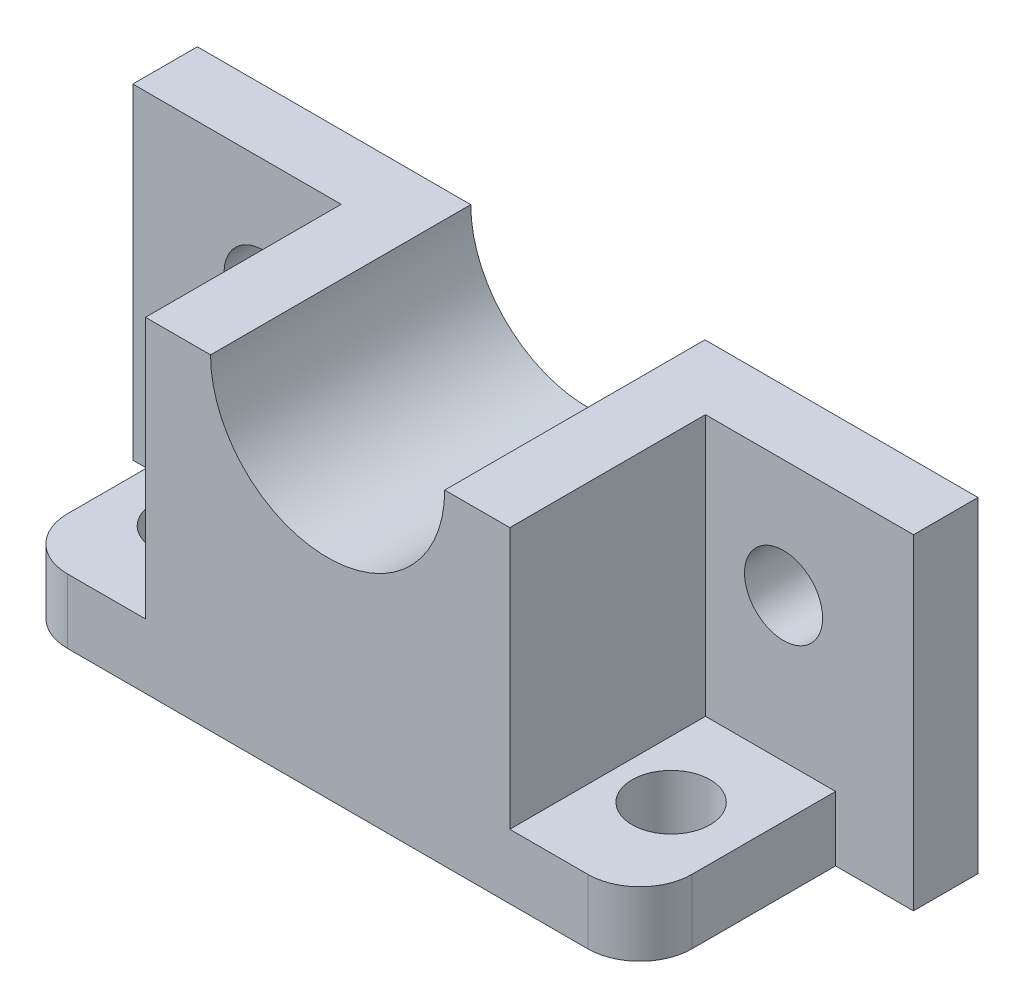
ISO-10303-21;
HEADER;
FILE_DESCRIPTION(('STEP AP214'),'2;1');
FILE_NAME('part.step','',(''),(''),'','','');
FILE_SCHEMA(('AUTOMOTIVE_DESIGN { 1 0 10303 214 1 1 1 1 }'));
ENDSEC;
DATA;
#1=APPLICATION_CONTEXT('core data for automotive mechanical design processes');
#2=APPLICATION_PROTOCOL_DEFINITION('international standard','automotive_design',2000,#1);
#3=PRODUCT_CONTEXT('',#1,'mechanical');
#4=PRODUCT('Part','Part','',(#3));
#5=PRODUCT_RELATED_PRODUCT_CATEGORY('part','',(#4));
#6=PRODUCT_DEFINITION_FORMATION('','',#4);
#7=PRODUCT_DEFINITION_CONTEXT('part definition',#1,'design');
#8=PRODUCT_DEFINITION('design','',#6,#7);
#9=PRODUCT_DEFINITION_SHAPE('','',#8);
#10=(LENGTH_UNIT() NAMED_UNIT(*) SI_UNIT(.MILLI.,.METRE.));
#11=(NAMED_UNIT(*) PLANE_ANGLE_UNIT() SI_UNIT($,.RADIAN.));
#12=(NAMED_UNIT(*) SI_UNIT($,.STERADIAN.) SOLID_ANGLE_UNIT());
#13=UNCERTAINTY_MEASURE_WITH_UNIT(LENGTH_MEASURE(1.E-05),#10,'distance_accuracy_value','');
#14=(GEOMETRIC_REPRESENTATION_CONTEXT(3) GLOBAL_UNCERTAINTY_ASSIGNED_CONTEXT((#13)) GLOBAL_UNIT_ASSIGNED_CONTEXT((#10,
#11,#12)) REPRESENTATION_CONTEXT('',''));
#15=CARTESIAN_POINT('',(0.,0.,0.));
#16=DIRECTION('',(0.,0.,1.));
#17=DIRECTION('',(1.,0.,0.));
#18=AXIS2_PLACEMENT_3D('',#15,#16,#17);
#19=CARTESIAN_POINT('',(-44.45,0.,63.5));
#20=DIRECTION('',(1.,0.,0.));
#21=DIRECTION('',(0.,1.,0.));
#22=AXIS2_PLACEMENT_3D('',#19,#20,#21);
#23=PLANE('',#22);
#24=DIRECTION('',(0.,0.,1.));
#25=VECTOR('',#24,1.);
#26=CARTESIAN_POINT('',(-44.45,-63.754,15.748));
#27=LINE('',#26,#25);
#28=CARTESIAN_POINT('',(-44.45,-63.754,15.748));
#29=VERTEX_POINT('',#28);
#30=CARTESIAN_POINT('',(-44.45,-63.754,63.5));
#31=VERTEX_POINT('',#30);
#32=EDGE_CURVE('E354',#29,#31,#27,.T.);
#33=ORIENTED_EDGE('',*,*,#32,.T.);
#34=DIRECTION('',(0.,-1.,0.));
#35=VECTOR('',#34,1.);
#36=CARTESIAN_POINT('',(-44.45,0.,63.5));
#37=LINE('',#36,#35);
#38=CARTESIAN_POINT('',(-44.45,0.,63.5));
#39=VERTEX_POINT('',#38);
#40=EDGE_CURVE('E279',#39,#31,#37,.T.);
#41=ORIENTED_EDGE('',*,*,#40,.F.);
#42=DIRECTION('',(0.,0.,-1.));
#43=VECTOR('',#42,1.);
#44=CARTESIAN_POINT('',(-44.45,0.,63.5));
#45=LINE('',#44,#43);
#46=CARTESIAN_POINT('',(-44.45,0.,15.748));
#47=VERTEX_POINT('',#46);
#48=EDGE_CURVE('E210',#39,#47,#45,.T.);
#49=ORIENTED_EDGE('',*,*,#48,.T.);
#50=DIRECTION('',(0.,-1.,0.));
#51=VECTOR('',#50,1.);
#52=CARTESIAN_POINT('',(-44.45,0.,15.748));
#53=LINE('',#52,#51);
#54=EDGE_CURVE('E298',#47,#29,#53,.T.);
#55=ORIENTED_EDGE('',*,*,#54,.T.);
#56=EDGE_LOOP('',(#33,#41,#49,#55));
#57=FACE_BOUND('',#56,.T.);
#58=ADVANCED_FACE('F43',(#57),#23,.F.);
#59=CARTESIAN_POINT('',(0.,0.,15.748));
#60=DIRECTION('',(0.,0.,1.));
#61=DIRECTION('',(1.,0.,0.));
#62=AXIS2_PLACEMENT_3D('',#59,#60,#61);
#63=PLANE('',#62);
#64=CARTESIAN_POINT('',(63.5,-28.702,15.748));
#65=DIRECTION('',(0.,0.,1.));
#66=DIRECTION('',(1.,0.,0.));
#67=AXIS2_PLACEMENT_3D('',#64,#65,#66);
#68=CIRCLE('',#67,9.52500000000001);
#69=CARTESIAN_POINT('',(73.025,-28.702,15.748));
#70=VERTEX_POINT('',#69);
#71=EDGE_CURVE('E180',#70,#70,#68,.T.);
#72=ORIENTED_EDGE('',*,*,#71,.F.);
#73=EDGE_LOOP('',(#72));
#74=FACE_BOUND('',#73,.T.);
#75=DIRECTION('',(0.,-1.,0.));
#76=VECTOR('',#75,1.);
#77=CARTESIAN_POINT('',(76.2,-63.754,15.748));
#78=LINE('',#77,#76);
#79=CARTESIAN_POINT('',(76.2,-63.754,15.748));
#80=VERTEX_POINT('',#79);
#81=CARTESIAN_POINT('',(76.2,-79.502,15.748));
#82=VERTEX_POINT('',#81);
#83=EDGE_CURVE('E161',#80,#82,#78,.T.);
#84=ORIENTED_EDGE('',*,*,#83,.T.);
#85=DIRECTION('',(1.,0.,0.));
#86=VECTOR('',#85,1.);
#87=CARTESIAN_POINT('',(-95.2928278149859,-79.502,15.748));
#88=LINE('',#87,#86);
#89=CARTESIAN_POINT('',(95.2071721850141,-79.502,15.748));
#90=VERTEX_POINT('',#89);
#91=EDGE_CURVE('E174',#82,#90,#88,.T.);
#92=ORIENTED_EDGE('',*,*,#91,.T.);
#93=DIRECTION('',(0.,1.,0.));
#94=VECTOR('',#93,1.);
#95=CARTESIAN_POINT('',(95.2071721850141,-79.502,15.748));
#96=LINE('',#95,#94);
#97=CARTESIAN_POINT('',(95.2071721850141,0.,15.748));
#98=VERTEX_POINT('',#97);
#99=EDGE_CURVE('E193',#90,#98,#96,.T.);
#100=ORIENTED_EDGE('',*,*,#99,.T.);
#101=DIRECTION('',(-1.,0.,0.));
#102=VECTOR('',#101,1.);
#103=CARTESIAN_POINT('',(95.2071721850141,0.,15.748));
#104=LINE('',#103,#102);
#105=CARTESIAN_POINT('',(44.45,0.,15.748));
#106=VERTEX_POINT('',#105);
#107=EDGE_CURVE('E200',#98,#106,#104,.T.);
#108=ORIENTED_EDGE('',*,*,#107,.T.);
#109=DIRECTION('',(0.,1.,0.));
#110=VECTOR('',#109,1.);
#111=CARTESIAN_POINT('',(44.45,0.,15.748));
#112=LINE('',#111,#110);
#113=CARTESIAN_POINT('',(44.45,-63.754,15.748));
#114=VERTEX_POINT('',#113);
#115=EDGE_CURVE('E302',#114,#106,#112,.T.);
#116=ORIENTED_EDGE('',*,*,#115,.F.);
#117=DIRECTION('',(1.,0.,0.));
#118=VECTOR('',#117,1.);
#119=CARTESIAN_POINT('',(44.45,-63.754,15.748));
#120=LINE('',#119,#118);
#121=EDGE_CURVE('E177',#114,#80,#120,.T.);
#122=ORIENTED_EDGE('',*,*,#121,.T.);
#123=EDGE_LOOP('',(#84,#92,#100,#108,#116,#122));
#124=FACE_BOUND('',#123,.T.);
#125=ADVANCED_FACE('F173',(#74,#124),#63,.T.);
#126=CARTESIAN_POINT('',(-28.575,0.,15.748));
#127=DIRECTION('',(0.,-1.,0.));
#128=DIRECTION('',(1.,0.,0.));
#129=AXIS2_PLACEMENT_3D('',#126,#127,#128);
#130=PLANE('',#129);
#131=DIRECTION('',(-1.,0.,0.));
#132=VECTOR('',#131,1.);
#133=CARTESIAN_POINT('',(-28.575,0.,0.));
#134=LINE('',#133,#132);
#135=CARTESIAN_POINT('',(-28.575,0.,0.));
#136=VERTEX_POINT('',#135);
#137=CARTESIAN_POINT('',(-95.2928278149859,0.,0.));
#138=VERTEX_POINT('',#137);
#139=EDGE_CURVE('E205',#136,#138,#134,.T.);
#140=ORIENTED_EDGE('',*,*,#139,.T.);
#141=DIRECTION('',(0.,0.,-1.));
#142=VECTOR('',#141,1.);
#143=CARTESIAN_POINT('',(-95.2928278149859,0.,15.748));
#144=LINE('',#143,#142);
#145=CARTESIAN_POINT('',(-95.2928278149859,0.,15.748));
#146=VERTEX_POINT('',#145);
#147=EDGE_CURVE('E242',#146,#138,#144,.T.);
#148=ORIENTED_EDGE('',*,*,#147,.F.);
#149=DIRECTION('',(-1.,0.,0.));
#150=VECTOR('',#149,1.);
#151=CARTESIAN_POINT('',(-28.575,0.,15.748));
#152=LINE('',#151,#150);
#153=EDGE_CURVE('E194',#47,#146,#152,.T.);
#154=ORIENTED_EDGE('',*,*,#153,.F.);
#155=ORIENTED_EDGE('',*,*,#48,.F.);
#156=DIRECTION('',(-1.,0.,0.));
#157=VECTOR('',#156,1.);
#158=CARTESIAN_POINT('',(-28.575,0.,63.5));
#159=LINE('',#158,#157);
#160=CARTESIAN_POINT('',(-28.575,0.,63.5));
#161=VERTEX_POINT('',#160);
#162=EDGE_CURVE('E286',#161,#39,#159,.T.);
#163=ORIENTED_EDGE('',*,*,#162,.F.);
#164=DIRECTION('',(0.,0.,-1.));
#165=VECTOR('',#164,1.);
#166=CARTESIAN_POINT('',(-28.575,0.,15.748));
#167=LINE('',#166,#165);
#168=EDGE_CURVE('E204',#161,#136,#167,.T.);
#169=ORIENTED_EDGE('',*,*,#168,.T.);
#170=EDGE_LOOP('',(#140,#148,#154,#155,#163,#169));
#171=FACE_BOUND('',#170,.T.);
#172=ADVANCED_FACE('F325',(#171),#130,.F.);
#173=CARTESIAN_POINT('',(-95.2928278149859,0.,15.748));
#174=DIRECTION('',(1.,0.,0.));
#175=DIRECTION('',(0.,1.,0.));
#176=AXIS2_PLACEMENT_3D('',#173,#174,#175);
#177=PLANE('',#176);
#178=DIRECTION('',(0.,-1.,0.));
#179=VECTOR('',#178,1.);
#180=CARTESIAN_POINT('',(-95.2928278149859,0.,0.));
#181=LINE('',#180,#179);
#182=CARTESIAN_POINT('',(-95.2928278149859,-79.502,0.));
#183=VERTEX_POINT('',#182);
#184=EDGE_CURVE('E209',#138,#183,#181,.T.);
#185=ORIENTED_EDGE('',*,*,#184,.T.);
#186=DIRECTION('',(0.,0.,-1.));
#187=VECTOR('',#186,1.);
#188=CARTESIAN_POINT('',(-95.2928278149859,-79.502,15.748));
#189=LINE('',#188,#187);
#190=CARTESIAN_POINT('',(-95.2928278149859,-79.502,15.748));
#191=VERTEX_POINT('',#190);
#192=EDGE_CURVE('E238',#191,#183,#189,.T.);
#193=ORIENTED_EDGE('',*,*,#192,.F.);
#194=DIRECTION('',(0.,-1.,0.));
#195=VECTOR('',#194,1.);
#196=CARTESIAN_POINT('',(-95.2928278149859,0.,15.748));
#197=LINE('',#196,#195);
#198=EDGE_CURVE('E188',#146,#191,#197,.T.);
#199=ORIENTED_EDGE('',*,*,#198,.F.);
#200=ORIENTED_EDGE('',*,*,#147,.T.);
#201=EDGE_LOOP('',(#185,#193,#199,#200));
#202=FACE_BOUND('',#201,.T.);
#203=ADVANCED_FACE('F323',(#202),#177,.F.);
#204=CARTESIAN_POINT('',(-95.2928278149859,-79.502,15.748));
#205=DIRECTION('',(0.,1.,0.));
#206=DIRECTION('',(0.,0.,1.));
#207=AXIS2_PLACEMENT_3D('',#204,#205,#206);
#208=PLANE('',#207);
#209=CARTESIAN_POINT('',(-58.42,-79.502,38.1));
#210=DIRECTION('',(0.,1.,0.));
#211=DIRECTION('',(0.,0.,1.));
#212=AXIS2_PLACEMENT_3D('',#209,#210,#211);
#213=CIRCLE('',#212,9.525);
#214=CARTESIAN_POINT('',(-58.42,-79.502,47.625));
#215=VERTEX_POINT('',#214);
#216=EDGE_CURVE('E565',#215,#215,#213,.T.);
#217=ORIENTED_EDGE('',*,*,#216,.T.);
#218=EDGE_LOOP('',(#217));
#219=FACE_BOUND('',#218,.T.);
#220=CARTESIAN_POINT('',(58.42,-79.502,38.1));
#221=DIRECTION('',(0.,1.,0.));
#222=DIRECTION('',(0.,0.,1.));
#223=AXIS2_PLACEMENT_3D('',#220,#221,#222);
#224=CIRCLE('',#223,9.52500000000001);
#225=CARTESIAN_POINT('',(58.42,-79.502,47.625));
#226=VERTEX_POINT('',#225);
#227=EDGE_CURVE('E577',#226,#226,#224,.T.);
#228=ORIENTED_EDGE('',*,*,#227,.T.);
#229=EDGE_LOOP('',(#228));
#230=FACE_BOUND('',#229,.T.);
#231=DIRECTION('',(0.,0.,1.));
#232=VECTOR('',#231,1.);
#233=CARTESIAN_POINT('',(76.2,-79.502,15.748));
#234=LINE('',#233,#232);
#235=CARTESIAN_POINT('',(76.2,-79.502,50.8));
#236=VERTEX_POINT('',#235);
#237=EDGE_CURVE('E157',#82,#236,#234,.T.);
#238=ORIENTED_EDGE('',*,*,#237,.T.);
#239=CARTESIAN_POINT('',(63.5,-79.502,50.8));
#240=DIRECTION('',(0.,1.,0.));
#241=DIRECTION('',(0.,0.,1.));
#242=AXIS2_PLACEMENT_3D('',#239,#240,#241);
#243=CIRCLE('',#242,12.7);
#244=CARTESIAN_POINT('',(63.5,-79.502,63.5));
#245=VERTEX_POINT('',#244);
#246=EDGE_CURVE('E251',#236,#245,#243,.F.);
#247=ORIENTED_EDGE('',*,*,#246,.T.);
#248=DIRECTION('',(1.,0.,0.));
#249=VECTOR('',#248,1.);
#250=CARTESIAN_POINT('',(-44.45,-79.502,63.5));
#251=LINE('',#250,#249);
#252=CARTESIAN_POINT('',(-63.5,-79.502,63.5));
#253=VERTEX_POINT('',#252);
#254=EDGE_CURVE('E273',#253,#245,#251,.T.);
#255=ORIENTED_EDGE('',*,*,#254,.F.);
#256=CARTESIAN_POINT('',(-63.5,-79.502,50.8));
#257=DIRECTION('',(0.,1.,0.));
#258=DIRECTION('',(0.,0.,1.));
#259=AXIS2_PLACEMENT_3D('',#256,#257,#258);
#260=CIRCLE('',#259,12.7);
#261=CARTESIAN_POINT('',(-76.2,-79.502,50.8));
#262=VERTEX_POINT('',#261);
#263=EDGE_CURVE('E248',#253,#262,#260,.F.);
#264=ORIENTED_EDGE('',*,*,#263,.T.);
#265=DIRECTION('',(0.,0.,-1.));
#266=VECTOR('',#265,1.);
#267=CARTESIAN_POINT('',(-76.2,-79.502,15.748));
#268=LINE('',#267,#266);
#269=CARTESIAN_POINT('',(-76.2,-79.502,15.748));
#270=VERTEX_POINT('',#269);
#271=EDGE_CURVE('E168',#262,#270,#268,.T.);
#272=ORIENTED_EDGE('',*,*,#271,.T.);
#273=EDGE_CURVE('E187',#191,#270,#88,.T.);
#274=ORIENTED_EDGE('',*,*,#273,.F.);
#275=ORIENTED_EDGE('',*,*,#192,.T.);
#276=DIRECTION('',(1.,0.,0.));
#277=VECTOR('',#276,1.);
#278=CARTESIAN_POINT('',(-95.2928278149859,-79.502,0.));
#279=LINE('',#278,#277);
#280=CARTESIAN_POINT('',(95.2071721850141,-79.502,0.));
#281=VERTEX_POINT('',#280);
#282=EDGE_CURVE('E213',#183,#281,#279,.T.);
#283=ORIENTED_EDGE('',*,*,#282,.T.);
#284=DIRECTION('',(0.,0.,-1.));
#285=VECTOR('',#284,1.);
#286=CARTESIAN_POINT('',(95.2071721850141,-79.502,15.748));
#287=LINE('',#286,#285);
#288=EDGE_CURVE('E184',#90,#281,#287,.T.);
#289=ORIENTED_EDGE('',*,*,#288,.F.);
#290=ORIENTED_EDGE('',*,*,#91,.F.);
#291=EDGE_LOOP('',(#238,#247,#255,#264,#272,#274,#275,#283,#289,#290));
#292=FACE_BOUND('',#291,.T.);
#293=ADVANCED_FACE('F182',(#219,#230,#292),#208,.F.);
#294=CARTESIAN_POINT('',(95.2071721850141,-79.502,15.748));
#295=DIRECTION('',(-1.,0.,0.));
#296=DIRECTION('',(0.,0.,1.));
#297=AXIS2_PLACEMENT_3D('',#294,#295,#296);
#298=PLANE('',#297);
#299=DIRECTION('',(0.,1.,0.));
#300=VECTOR('',#299,1.);
#301=CARTESIAN_POINT('',(95.2071721850141,-79.502,0.));
#302=LINE('',#301,#300);
#303=CARTESIAN_POINT('',(95.2071721850141,0.,0.));
#304=VERTEX_POINT('',#303);
#305=EDGE_CURVE('E216',#281,#304,#302,.T.);
#306=ORIENTED_EDGE('',*,*,#305,.T.);
#307=DIRECTION('',(0.,0.,-1.));
#308=VECTOR('',#307,1.);
#309=CARTESIAN_POINT('',(95.2071721850141,0.,15.748));
#310=LINE('',#309,#308);
#311=EDGE_CURVE('E232',#98,#304,#310,.T.);
#312=ORIENTED_EDGE('',*,*,#311,.F.);
#313=ORIENTED_EDGE('',*,*,#99,.F.);
#314=ORIENTED_EDGE('',*,*,#288,.T.);
#315=EDGE_LOOP('',(#306,#312,#313,#314));
#316=FACE_BOUND('',#315,.T.);
#317=ADVANCED_FACE('F343',(#316),#298,.F.);
#318=CARTESIAN_POINT('',(95.2071721850141,0.,15.748));
#319=DIRECTION('',(0.,-1.,0.));
#320=DIRECTION('',(0.,0.,-1.));
#321=AXIS2_PLACEMENT_3D('',#318,#319,#320);
#322=PLANE('',#321);
#323=DIRECTION('',(-1.,0.,0.));
#324=VECTOR('',#323,1.);
#325=CARTESIAN_POINT('',(95.2071721850141,0.,0.));
#326=LINE('',#325,#324);
#327=CARTESIAN_POINT('',(28.575,0.,0.));
#328=VERTEX_POINT('',#327);
#329=EDGE_CURVE('E219',#304,#328,#326,.T.);
#330=ORIENTED_EDGE('',*,*,#329,.T.);
#331=DIRECTION('',(0.,0.,-1.));
#332=VECTOR('',#331,1.);
#333=CARTESIAN_POINT('',(28.575,0.,15.748));
#334=LINE('',#333,#332);
#335=CARTESIAN_POINT('',(28.575,0.,63.5));
#336=VERTEX_POINT('',#335);
#337=EDGE_CURVE('E229',#336,#328,#334,.T.);
#338=ORIENTED_EDGE('',*,*,#337,.F.);
#339=DIRECTION('',(-1.,0.,0.));
#340=VECTOR('',#339,1.);
#341=CARTESIAN_POINT('',(44.45,0.,63.5));
#342=LINE('',#341,#340);
#343=CARTESIAN_POINT('',(44.45,0.,63.5));
#344=VERTEX_POINT('',#343);
#345=EDGE_CURVE('E283',#344,#336,#342,.T.);
#346=ORIENTED_EDGE('',*,*,#345,.F.);
#347=DIRECTION('',(0.,0.,-1.));
#348=VECTOR('',#347,1.);
#349=CARTESIAN_POINT('',(44.45,0.,63.5));
#350=LINE('',#349,#348);
#351=EDGE_CURVE('E297',#344,#106,#350,.T.);
#352=ORIENTED_EDGE('',*,*,#351,.T.);
#353=ORIENTED_EDGE('',*,*,#107,.F.);
#354=ORIENTED_EDGE('',*,*,#311,.T.);
#355=EDGE_LOOP('',(#330,#338,#346,#352,#353,#354));
#356=FACE_BOUND('',#355,.T.);
#357=ADVANCED_FACE('F338',(#356),#322,.F.);
#358=CARTESIAN_POINT('',(0.,0.,15.748));
#359=DIRECTION('',(0.,0.,-1.));
#360=DIRECTION('',(-1.,0.,0.));
#361=AXIS2_PLACEMENT_3D('',#358,#359,#360);
#362=CYLINDRICAL_SURFACE('',#361,28.575);
#363=CARTESIAN_POINT('',(0.,0.,0.));
#364=DIRECTION('',(0.,0.,1.));
#365=DIRECTION('',(1.,0.,0.));
#366=AXIS2_PLACEMENT_3D('',#363,#364,#365);
#367=CIRCLE('',#366,28.575);
#368=EDGE_CURVE('E223',#136,#328,#367,.T.);
#369=ORIENTED_EDGE('',*,*,#368,.F.);
#370=ORIENTED_EDGE('',*,*,#168,.F.);
#371=CARTESIAN_POINT('',(0.,0.,63.5));
#372=DIRECTION('',(0.,0.,-1.));
#373=DIRECTION('',(1.,0.,0.));
#374=AXIS2_PLACEMENT_3D('',#371,#372,#373);
#375=CIRCLE('',#374,28.575);
#376=EDGE_CURVE('E293',#336,#161,#375,.T.);
#377=ORIENTED_EDGE('',*,*,#376,.F.);
#378=ORIENTED_EDGE('',*,*,#337,.T.);
#379=EDGE_LOOP('',(#369,#370,#377,#378));
#380=FACE_BOUND('',#379,.T.);
#381=ADVANCED_FACE('F334',(#380),#362,.F.);
#382=CARTESIAN_POINT('',(-63.5,-28.702,15.748));
#383=DIRECTION('',(0.,0.,1.));
#384=DIRECTION('',(1.,0.,0.));
#385=AXIS2_PLACEMENT_3D('',#382,#383,#384);
#386=CIRCLE('',#385,9.525);
#387=CARTESIAN_POINT('',(-53.975,-28.702,15.748));
#388=VERTEX_POINT('',#387);
#389=EDGE_CURVE('E587',#388,#388,#386,.T.);
#390=ORIENTED_EDGE('',*,*,#389,.F.);
#391=EDGE_LOOP('',(#390));
#392=FACE_BOUND('',#391,.T.);
#393=DIRECTION('',(0.,-1.,0.));
#394=VECTOR('',#393,1.);
#395=CARTESIAN_POINT('',(-76.2,-63.754,15.748));
#396=LINE('',#395,#394);
#397=CARTESIAN_POINT('',(-76.2,-63.754,15.748));
#398=VERTEX_POINT('',#397);
#399=EDGE_CURVE('E303',#398,#270,#396,.T.);
#400=ORIENTED_EDGE('',*,*,#399,.F.);
#401=DIRECTION('',(1.,0.,0.));
#402=VECTOR('',#401,1.);
#403=CARTESIAN_POINT('',(-44.45,-63.754,15.748));
#404=LINE('',#403,#402);
#405=EDGE_CURVE('E364',#398,#29,#404,.T.);
#406=ORIENTED_EDGE('',*,*,#405,.T.);
#407=ORIENTED_EDGE('',*,*,#54,.F.);
#408=ORIENTED_EDGE('',*,*,#153,.T.);
#409=ORIENTED_EDGE('',*,*,#198,.T.);
#410=ORIENTED_EDGE('',*,*,#273,.T.);
#411=EDGE_LOOP('',(#400,#406,#407,#408,#409,#410));
#412=FACE_BOUND('',#411,.T.);
#413=ADVANCED_FACE('F316',(#392,#412),#63,.T.);
#414=CARTESIAN_POINT('',(0.,0.,0.));
#415=DIRECTION('',(0.,0.,1.));
#416=DIRECTION('',(1.,0.,0.));
#417=AXIS2_PLACEMENT_3D('',#414,#415,#416);
#418=PLANE('',#417);
#419=CARTESIAN_POINT('',(63.5,-28.702,0.));
#420=DIRECTION('',(0.,0.,1.));
#421=DIRECTION('',(1.,0.,0.));
#422=AXIS2_PLACEMENT_3D('',#419,#420,#421);
#423=CIRCLE('',#422,9.52500000000001);
#424=CARTESIAN_POINT('',(73.025,-28.702,0.));
#425=VERTEX_POINT('',#424);
#426=EDGE_CURVE('E583',#425,#425,#423,.T.);
#427=ORIENTED_EDGE('',*,*,#426,.T.);
#428=EDGE_LOOP('',(#427));
#429=FACE_BOUND('',#428,.T.);
#430=CARTESIAN_POINT('',(-63.5,-28.702,0.));
#431=DIRECTION('',(0.,0.,1.));
#432=DIRECTION('',(1.,0.,0.));
#433=AXIS2_PLACEMENT_3D('',#430,#431,#432);
#434=CIRCLE('',#433,9.525);
#435=CARTESIAN_POINT('',(-53.975,-28.702,0.));
#436=VERTEX_POINT('',#435);
#437=EDGE_CURVE('E574',#436,#436,#434,.T.);
#438=ORIENTED_EDGE('',*,*,#437,.T.);
#439=EDGE_LOOP('',(#438));
#440=FACE_BOUND('',#439,.T.);
#441=ORIENTED_EDGE('',*,*,#139,.F.);
#442=ORIENTED_EDGE('',*,*,#368,.T.);
#443=ORIENTED_EDGE('',*,*,#329,.F.);
#444=ORIENTED_EDGE('',*,*,#305,.F.);
#445=ORIENTED_EDGE('',*,*,#282,.F.);
#446=ORIENTED_EDGE('',*,*,#184,.F.);
#447=EDGE_LOOP('',(#441,#442,#443,#444,#445,#446));
#448=FACE_BOUND('',#447,.T.);
#449=ADVANCED_FACE('F330',(#429,#440,#448),#418,.F.);
#450=CARTESIAN_POINT('',(44.45,0.,63.5));
#451=DIRECTION('',(-1.,0.,0.));
#452=DIRECTION('',(0.,-1.,0.));
#453=AXIS2_PLACEMENT_3D('',#450,#451,#452);
#454=PLANE('',#453);
#455=DIRECTION('',(0.,1.,0.));
#456=VECTOR('',#455,1.);
#457=CARTESIAN_POINT('',(44.45,0.,63.5));
#458=LINE('',#457,#456);
#459=CARTESIAN_POINT('',(44.45,-63.754,63.5));
#460=VERTEX_POINT('',#459);
#461=EDGE_CURVE('E278',#460,#344,#458,.T.);
#462=ORIENTED_EDGE('',*,*,#461,.F.);
#463=DIRECTION('',(0.,0.,-1.));
#464=VECTOR('',#463,1.);
#465=CARTESIAN_POINT('',(44.45,-63.754,15.748));
#466=LINE('',#465,#464);
#467=EDGE_CURVE('E169',#460,#114,#466,.T.);
#468=ORIENTED_EDGE('',*,*,#467,.T.);
#469=ORIENTED_EDGE('',*,*,#115,.T.);
#470=ORIENTED_EDGE('',*,*,#351,.F.);
#471=EDGE_LOOP('',(#462,#468,#469,#470));
#472=FACE_BOUND('',#471,.T.);
#473=ADVANCED_FACE('F347',(#472),#454,.F.);
#474=CARTESIAN_POINT('',(0.,0.,63.5));
#475=DIRECTION('',(0.,0.,1.));
#476=DIRECTION('',(1.,0.,0.));
#477=AXIS2_PLACEMENT_3D('',#474,#475,#476);
#478=PLANE('',#477);
#479=ORIENTED_EDGE('',*,*,#254,.T.);
#480=DIRECTION('',(0.,-1.,0.));
#481=VECTOR('',#480,1.);
#482=CARTESIAN_POINT('',(63.5,0.,63.5));
#483=LINE('',#482,#481);
#484=CARTESIAN_POINT('',(63.5,-63.754,63.5));
#485=VERTEX_POINT('',#484);
#486=EDGE_CURVE('E66',#245,#485,#483,.F.);
#487=ORIENTED_EDGE('',*,*,#486,.T.);
#488=DIRECTION('',(-1.,0.,0.));
#489=VECTOR('',#488,1.);
#490=CARTESIAN_POINT('',(44.45,-63.754,63.5));
#491=LINE('',#490,#489);
#492=EDGE_CURVE('E179',#485,#460,#491,.T.);
#493=ORIENTED_EDGE('',*,*,#492,.T.);
#494=ORIENTED_EDGE('',*,*,#461,.T.);
#495=ORIENTED_EDGE('',*,*,#345,.T.);
#496=ORIENTED_EDGE('',*,*,#376,.T.);
#497=ORIENTED_EDGE('',*,*,#162,.T.);
#498=ORIENTED_EDGE('',*,*,#40,.T.);
#499=DIRECTION('',(-1.,0.,0.));
#500=VECTOR('',#499,1.);
#501=CARTESIAN_POINT('',(-44.45,-63.754,63.5));
#502=LINE('',#501,#500);
#503=CARTESIAN_POINT('',(-63.5,-63.754,63.5));
#504=VERTEX_POINT('',#503);
#505=EDGE_CURVE('E358',#31,#504,#502,.T.);
#506=ORIENTED_EDGE('',*,*,#505,.T.);
#507=DIRECTION('',(0.,-1.,0.));
#508=VECTOR('',#507,1.);
#509=CARTESIAN_POINT('',(-63.5,0.,63.5));
#510=LINE('',#509,#508);
#511=EDGE_CURVE('E254',#504,#253,#510,.T.);
#512=ORIENTED_EDGE('',*,*,#511,.T.);
#513=EDGE_LOOP('',(#479,#487,#493,#494,#495,#496,#497,#498,#506,#512));
#514=FACE_BOUND('',#513,.T.);
#515=ADVANCED_FACE('F274',(#514),#478,.T.);
#516=CARTESIAN_POINT('',(-76.2,-63.754,15.748));
#517=DIRECTION('',(-1.,0.,0.));
#518=DIRECTION('',(0.,0.,1.));
#519=AXIS2_PLACEMENT_3D('',#516,#517,#518);
#520=PLANE('',#519);
#521=ORIENTED_EDGE('',*,*,#271,.F.);
#522=DIRECTION('',(0.,-1.,0.));
#523=VECTOR('',#522,1.);
#524=CARTESIAN_POINT('',(-76.2,-63.754,50.8));
#525=LINE('',#524,#523);
#526=CARTESIAN_POINT('',(-76.2,-63.754,50.8));
#527=VERTEX_POINT('',#526);
#528=EDGE_CURVE('E52',#262,#527,#525,.F.);
#529=ORIENTED_EDGE('',*,*,#528,.T.);
#530=DIRECTION('',(0.,0.,-1.));
#531=VECTOR('',#530,1.);
#532=CARTESIAN_POINT('',(-76.2,-63.754,15.748));
#533=LINE('',#532,#531);
#534=EDGE_CURVE('E361',#527,#398,#533,.T.);
#535=ORIENTED_EDGE('',*,*,#534,.T.);
#536=ORIENTED_EDGE('',*,*,#399,.T.);
#537=EDGE_LOOP('',(#521,#529,#535,#536));
#538=FACE_BOUND('',#537,.T.);
#539=ADVANCED_FACE('F377',(#538),#520,.T.);
#540=CARTESIAN_POINT('',(0.,-63.754,0.));
#541=DIRECTION('',(0.,-1.,0.));
#542=DIRECTION('',(0.,0.,-1.));
#543=AXIS2_PLACEMENT_3D('',#540,#541,#542);
#544=PLANE('',#543);
#545=CARTESIAN_POINT('',(-58.42,-63.754,38.1));
#546=DIRECTION('',(0.,1.,0.));
#547=DIRECTION('',(0.,0.,1.));
#548=AXIS2_PLACEMENT_3D('',#545,#546,#547);
#549=CIRCLE('',#548,9.525);
#550=CARTESIAN_POINT('',(-58.42,-63.754,47.625));
#551=VERTEX_POINT('',#550);
#552=EDGE_CURVE('E568',#551,#551,#549,.T.);
#553=ORIENTED_EDGE('',*,*,#552,.F.);
#554=EDGE_LOOP('',(#553));
#555=FACE_BOUND('',#554,.T.);
#556=ORIENTED_EDGE('',*,*,#534,.F.);
#557=CARTESIAN_POINT('',(-63.5,-63.754,50.8));
#558=DIRECTION('',(0.,-1.,0.));
#559=DIRECTION('',(0.,0.,-1.));
#560=AXIS2_PLACEMENT_3D('',#557,#558,#559);
#561=CIRCLE('',#560,12.7);
#562=EDGE_CURVE('E11',#527,#504,#561,.F.);
#563=ORIENTED_EDGE('',*,*,#562,.T.);
#564=ORIENTED_EDGE('',*,*,#505,.F.);
#565=ORIENTED_EDGE('',*,*,#32,.F.);
#566=ORIENTED_EDGE('',*,*,#405,.F.);
#567=EDGE_LOOP('',(#556,#563,#564,#565,#566));
#568=FACE_BOUND('',#567,.T.);
#569=ADVANCED_FACE('F376',(#555,#568),#544,.F.);
#570=CARTESIAN_POINT('',(76.2,-63.754,15.748));
#571=DIRECTION('',(1.,0.,0.));
#572=DIRECTION('',(0.,0.,-1.));
#573=AXIS2_PLACEMENT_3D('',#570,#571,#572);
#574=PLANE('',#573);
#575=DIRECTION('',(0.,0.,1.));
#576=VECTOR('',#575,1.);
#577=CARTESIAN_POINT('',(76.2,-63.754,15.748));
#578=LINE('',#577,#576);
#579=CARTESIAN_POINT('',(76.2,-63.754,50.8));
#580=VERTEX_POINT('',#579);
#581=EDGE_CURVE('E266',#80,#580,#578,.T.);
#582=ORIENTED_EDGE('',*,*,#581,.T.);
#583=DIRECTION('',(0.,-1.,0.));
#584=VECTOR('',#583,1.);
#585=CARTESIAN_POINT('',(76.2,-63.754,50.8));
#586=LINE('',#585,#584);
#587=EDGE_CURVE('E164',#580,#236,#586,.T.);
#588=ORIENTED_EDGE('',*,*,#587,.T.);
#589=ORIENTED_EDGE('',*,*,#237,.F.);
#590=ORIENTED_EDGE('',*,*,#83,.F.);
#591=EDGE_LOOP('',(#582,#588,#589,#590));
#592=FACE_BOUND('',#591,.T.);
#593=ADVANCED_FACE('F160',(#592),#574,.T.);
#594=CARTESIAN_POINT('',(0.,-63.754,0.));
#595=DIRECTION('',(0.,1.,0.));
#596=DIRECTION('',(0.,0.,1.));
#597=AXIS2_PLACEMENT_3D('',#594,#595,#596);
#598=PLANE('',#597);
#599=CARTESIAN_POINT('',(58.42,-63.754,38.1));
#600=DIRECTION('',(0.,1.,0.));
#601=DIRECTION('',(0.,0.,1.));
#602=AXIS2_PLACEMENT_3D('',#599,#600,#601);
#603=CIRCLE('',#602,9.52500000000001);
#604=CARTESIAN_POINT('',(58.42,-63.754,47.625));
#605=VERTEX_POINT('',#604);
#606=EDGE_CURVE('E570',#605,#605,#603,.T.);
#607=ORIENTED_EDGE('',*,*,#606,.F.);
#608=EDGE_LOOP('',(#607));
#609=FACE_BOUND('',#608,.T.);
#610=ORIENTED_EDGE('',*,*,#492,.F.);
#611=CARTESIAN_POINT('',(63.5,-63.754,50.8));
#612=DIRECTION('',(0.,1.,0.));
#613=DIRECTION('',(0.,0.,1.));
#614=AXIS2_PLACEMENT_3D('',#611,#612,#613);
#615=CIRCLE('',#614,12.7);
#616=EDGE_CURVE('E260',#485,#580,#615,.T.);
#617=ORIENTED_EDGE('',*,*,#616,.T.);
#618=ORIENTED_EDGE('',*,*,#581,.F.);
#619=ORIENTED_EDGE('',*,*,#121,.F.);
#620=ORIENTED_EDGE('',*,*,#467,.F.);
#621=EDGE_LOOP('',(#610,#617,#618,#619,#620));
#622=FACE_BOUND('',#621,.T.);
#623=ADVANCED_FACE('F265',(#609,#622),#598,.T.);
#624=CARTESIAN_POINT('',(63.5,-63.754,50.8));
#625=DIRECTION('',(0.,-1.,0.));
#626=DIRECTION('',(0.,0.,-1.));
#627=AXIS2_PLACEMENT_3D('',#624,#625,#626);
#628=CYLINDRICAL_SURFACE('',#627,12.7);
#629=ORIENTED_EDGE('',*,*,#616,.F.);
#630=ORIENTED_EDGE('',*,*,#486,.F.);
#631=ORIENTED_EDGE('',*,*,#246,.F.);
#632=ORIENTED_EDGE('',*,*,#587,.F.);
#633=EDGE_LOOP('',(#629,#630,#631,#632));
#634=FACE_BOUND('',#633,.T.);
#635=ADVANCED_FACE('F271',(#634),#628,.T.);
#636=CARTESIAN_POINT('',(-63.5,0.,50.8));
#637=DIRECTION('',(0.,-1.,0.));
#638=DIRECTION('',(0.,0.,-1.));
#639=AXIS2_PLACEMENT_3D('',#636,#637,#638);
#640=CYLINDRICAL_SURFACE('',#639,12.7);
#641=ORIENTED_EDGE('',*,*,#562,.F.);
#642=ORIENTED_EDGE('',*,*,#528,.F.);
#643=ORIENTED_EDGE('',*,*,#263,.F.);
#644=ORIENTED_EDGE('',*,*,#511,.F.);
#645=EDGE_LOOP('',(#641,#642,#643,#644));
#646=FACE_BOUND('',#645,.T.);
#647=ADVANCED_FACE('F45',(#646),#640,.T.);
#648=CARTESIAN_POINT('',(-63.5,-28.702,0.));
#649=DIRECTION('',(0.,0.,1.));
#650=DIRECTION('',(1.,0.,0.));
#651=AXIS2_PLACEMENT_3D('',#648,#649,#650);
#652=CYLINDRICAL_SURFACE('',#651,9.525);
#653=ORIENTED_EDGE('',*,*,#389,.T.);
#654=EDGE_LOOP('',(#653));
#655=FACE_BOUND('',#654,.T.);
#656=ORIENTED_EDGE('',*,*,#437,.F.);
#657=EDGE_LOOP('',(#656));
#658=FACE_BOUND('',#657,.T.);
#659=ADVANCED_FACE('F381',(#655,#658),#652,.F.);
#660=CARTESIAN_POINT('',(63.5,-28.702,0.));
#661=DIRECTION('',(0.,0.,1.));
#662=DIRECTION('',(1.,0.,0.));
#663=AXIS2_PLACEMENT_3D('',#660,#661,#662);
#664=CYLINDRICAL_SURFACE('',#663,9.52500000000001);
#665=ORIENTED_EDGE('',*,*,#71,.T.);
#666=EDGE_LOOP('',(#665));
#667=FACE_BOUND('',#666,.T.);
#668=ORIENTED_EDGE('',*,*,#426,.F.);
#669=EDGE_LOOP('',(#668));
#670=FACE_BOUND('',#669,.T.);
#671=ADVANCED_FACE('F386',(#667,#670),#664,.F.);
#672=CARTESIAN_POINT('',(58.42,-79.502,38.1));
#673=DIRECTION('',(0.,1.,0.));
#674=DIRECTION('',(0.,0.,1.));
#675=AXIS2_PLACEMENT_3D('',#672,#673,#674);
#676=CYLINDRICAL_SURFACE('',#675,9.52500000000001);
#677=ORIENTED_EDGE('',*,*,#227,.F.);
#678=EDGE_LOOP('',(#677));
#679=FACE_BOUND('',#678,.T.);
#680=ORIENTED_EDGE('',*,*,#606,.T.);
#681=EDGE_LOOP('',(#680));
#682=FACE_BOUND('',#681,.T.);
#683=ADVANCED_FACE('F534',(#679,#682),#676,.F.);
#684=CARTESIAN_POINT('',(-58.42,-79.502,38.1));
#685=DIRECTION('',(0.,1.,0.));
#686=DIRECTION('',(0.,0.,1.));
#687=AXIS2_PLACEMENT_3D('',#684,#685,#686);
#688=CYLINDRICAL_SURFACE('',#687,9.525);
#689=ORIENTED_EDGE('',*,*,#216,.F.);
#690=EDGE_LOOP('',(#689));
#691=FACE_BOUND('',#690,.T.);
#692=ORIENTED_EDGE('',*,*,#552,.T.);
#693=EDGE_LOOP('',(#692));
#694=FACE_BOUND('',#693,.T.);
#695=ADVANCED_FACE('F544',(#691,#694),#688,.F.);
#696=CLOSED_SHELL('',(#58,#125,#172,#203,#293,#317,#357,#381,#413,#449,#473,#515,#539,#569,#593,
#623,#635,#647,#659,#671,#683,#695));
#697=MANIFOLD_SOLID_BREP('B2',#696);
#698=ADVANCED_BREP_SHAPE_REPRESENTATION('',(#18,#697),#14);
#699=SHAPE_DEFINITION_REPRESENTATION(#9,#698);
ENDSEC;
END-ISO-10303-21;
